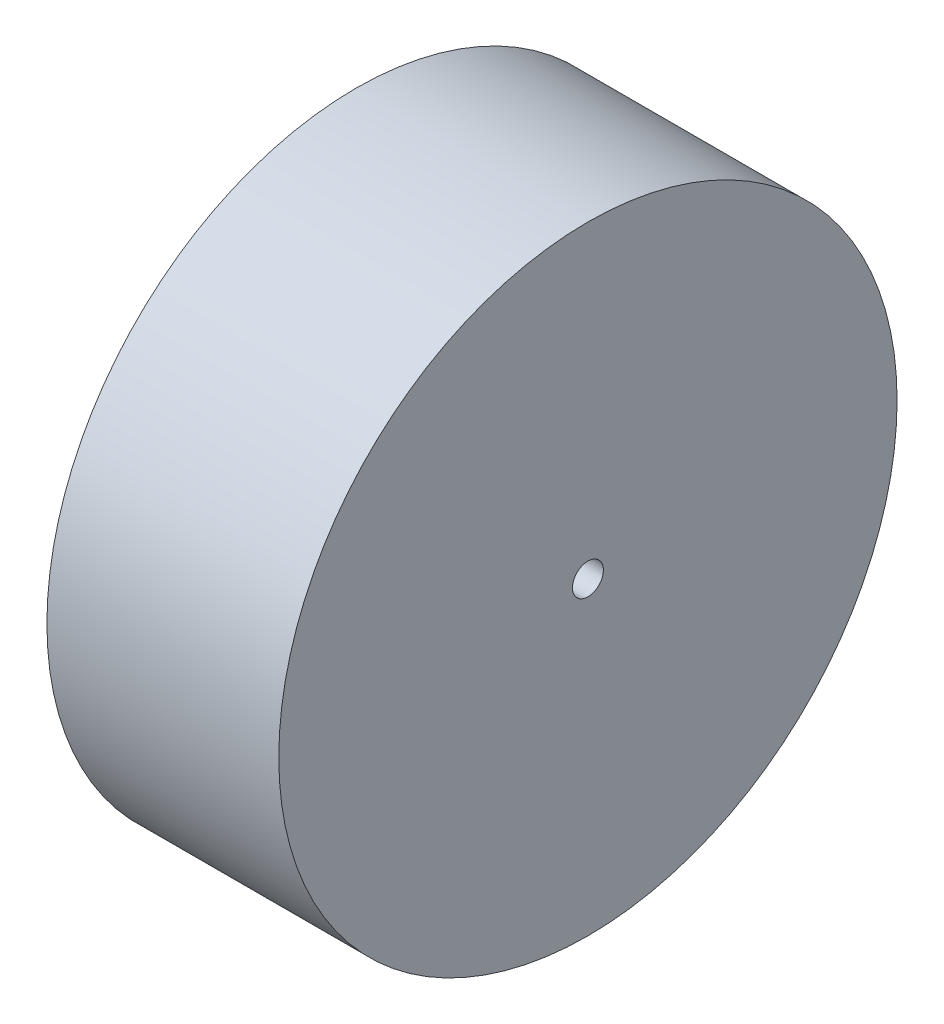
ISO-10303-21;
HEADER;
FILE_DESCRIPTION(('STEP AP214'),'2;1');
FILE_NAME('part.step','',(''),(''),'','','');
FILE_SCHEMA(('AUTOMOTIVE_DESIGN { 1 0 10303 214 1 1 1 1 }'));
ENDSEC;
DATA;
#1=APPLICATION_CONTEXT('core data for automotive mechanical design processes');
#2=APPLICATION_PROTOCOL_DEFINITION('international standard','automotive_design',2000,#1);
#3=PRODUCT_CONTEXT('',#1,'mechanical');
#4=PRODUCT('Part','Part','',(#3));
#5=PRODUCT_RELATED_PRODUCT_CATEGORY('part','',(#4));
#6=PRODUCT_DEFINITION_FORMATION('','',#4);
#7=PRODUCT_DEFINITION_CONTEXT('part definition',#1,'design');
#8=PRODUCT_DEFINITION('design','',#6,#7);
#9=PRODUCT_DEFINITION_SHAPE('','',#8);
#10=(LENGTH_UNIT() NAMED_UNIT(*) SI_UNIT(.MILLI.,.METRE.));
#11=(NAMED_UNIT(*) PLANE_ANGLE_UNIT() SI_UNIT($,.RADIAN.));
#12=(NAMED_UNIT(*) SI_UNIT($,.STERADIAN.) SOLID_ANGLE_UNIT());
#13=UNCERTAINTY_MEASURE_WITH_UNIT(LENGTH_MEASURE(1.E-05),#10,'distance_accuracy_value','');
#14=(GEOMETRIC_REPRESENTATION_CONTEXT(3) GLOBAL_UNCERTAINTY_ASSIGNED_CONTEXT((#13)) GLOBAL_UNIT_ASSIGNED_CONTEXT((#10,
#11,#12)) REPRESENTATION_CONTEXT('',''));
#15=CARTESIAN_POINT('',(0.,0.,0.));
#16=DIRECTION('',(0.,0.,1.));
#17=DIRECTION('',(1.,0.,0.));
#18=AXIS2_PLACEMENT_3D('',#15,#16,#17);
#19=CARTESIAN_POINT('',(9.525,0.,0.));
#20=DIRECTION('',(1.,0.,0.));
#21=DIRECTION('',(0.,0.,-1.));
#22=AXIS2_PLACEMENT_3D('',#19,#20,#21);
#23=PLANE('',#22);
#24=CARTESIAN_POINT('',(9.525,0.,0.));
#25=DIRECTION('',(1.,0.,0.));
#26=DIRECTION('',(0.,0.,-1.));
#27=AXIS2_PLACEMENT_3D('',#24,#25,#26);
#28=CIRCLE('',#27,25.4);
#29=CARTESIAN_POINT('',(9.525,0.,25.4));
#30=VERTEX_POINT('',#29);
#31=EDGE_CURVE('E10',#30,#30,#28,.T.);
#32=ORIENTED_EDGE('',*,*,#31,.T.);
#33=EDGE_LOOP('',(#32));
#34=FACE_BOUND('',#33,.T.);
#35=CARTESIAN_POINT('',(9.525,0.,0.));
#36=DIRECTION('',(1.,0.,0.));
#37=DIRECTION('',(0.,0.,-1.));
#38=AXIS2_PLACEMENT_3D('',#35,#36,#37);
#39=CIRCLE('',#38,1.27);
#40=CARTESIAN_POINT('',(9.525,0.,1.27));
#41=VERTEX_POINT('',#40);
#42=EDGE_CURVE('E49',#41,#41,#39,.T.);
#43=ORIENTED_EDGE('',*,*,#42,.F.);
#44=EDGE_LOOP('',(#43));
#45=FACE_BOUND('',#44,.T.);
#46=ADVANCED_FACE('F39',(#34,#45),#23,.T.);
#47=CARTESIAN_POINT('',(-9.525,0.,0.));
#48=DIRECTION('',(1.,0.,0.));
#49=DIRECTION('',(0.,0.,-1.));
#50=AXIS2_PLACEMENT_3D('',#47,#48,#49);
#51=PLANE('',#50);
#52=CARTESIAN_POINT('',(-9.525,0.,0.));
#53=DIRECTION('',(1.,0.,0.));
#54=DIRECTION('',(0.,0.,-1.));
#55=AXIS2_PLACEMENT_3D('',#52,#53,#54);
#56=CIRCLE('',#55,25.4);
#57=CARTESIAN_POINT('',(-9.525,0.,25.4));
#58=VERTEX_POINT('',#57);
#59=EDGE_CURVE('E43',#58,#58,#56,.T.);
#60=ORIENTED_EDGE('',*,*,#59,.F.);
#61=EDGE_LOOP('',(#60));
#62=FACE_BOUND('',#61,.T.);
#63=CARTESIAN_POINT('',(-9.525,0.,0.));
#64=DIRECTION('',(1.,0.,0.));
#65=DIRECTION('',(0.,0.,-1.));
#66=AXIS2_PLACEMENT_3D('',#63,#64,#65);
#67=CIRCLE('',#66,1.27);
#68=CARTESIAN_POINT('',(-9.525,0.,1.27));
#69=VERTEX_POINT('',#68);
#70=EDGE_CURVE('E55',#69,#69,#67,.T.);
#71=ORIENTED_EDGE('',*,*,#70,.T.);
#72=EDGE_LOOP('',(#71));
#73=FACE_BOUND('',#72,.T.);
#74=ADVANCED_FACE('F65',(#62,#73),#51,.F.);
#75=CARTESIAN_POINT('',(9.525,0.,0.));
#76=DIRECTION('',(-1.,0.,0.));
#77=DIRECTION('',(0.,0.,1.));
#78=AXIS2_PLACEMENT_3D('',#75,#76,#77);
#79=CYLINDRICAL_SURFACE('',#78,25.4);
#80=CARTESIAN_POINT('',(9.525,0.,25.4));
#81=CARTESIAN_POINT('',(9.3265625,0.,25.4));
#82=CARTESIAN_POINT('',(9.128125,0.,25.4));
#83=CARTESIAN_POINT('',(8.73125,0.,25.4));
#84=CARTESIAN_POINT('',(8.5328125,0.,25.4));
#85=CARTESIAN_POINT('',(8.1359375,0.,25.4));
#86=CARTESIAN_POINT('',(7.9375,0.,25.4));
#87=CARTESIAN_POINT('',(7.540625,0.,25.4));
#88=CARTESIAN_POINT('',(7.3421875,0.,25.4));
#89=CARTESIAN_POINT('',(6.9453125,0.,25.4));
#90=CARTESIAN_POINT('',(6.746875,0.,25.4));
#91=CARTESIAN_POINT('',(6.35,0.,25.4));
#92=CARTESIAN_POINT('',(6.1515625,0.,25.4));
#93=CARTESIAN_POINT('',(5.7546875,0.,25.4));
#94=CARTESIAN_POINT('',(5.55625,0.,25.4));
#95=CARTESIAN_POINT('',(5.159375,0.,25.4));
#96=CARTESIAN_POINT('',(4.9609375,0.,25.4));
#97=CARTESIAN_POINT('',(4.5640625,0.,25.4));
#98=CARTESIAN_POINT('',(4.365625,0.,25.4));
#99=CARTESIAN_POINT('',(3.96875,0.,25.4));
#100=CARTESIAN_POINT('',(3.7703125,0.,25.4));
#101=CARTESIAN_POINT('',(3.3734375,0.,25.4));
#102=CARTESIAN_POINT('',(3.175,0.,25.4));
#103=CARTESIAN_POINT('',(2.778125,0.,25.4));
#104=CARTESIAN_POINT('',(2.5796875,0.,25.4));
#105=CARTESIAN_POINT('',(2.1828125,0.,25.4));
#106=CARTESIAN_POINT('',(1.984375,0.,25.4));
#107=CARTESIAN_POINT('',(1.5875,0.,25.4));
#108=CARTESIAN_POINT('',(1.3890625,0.,25.4));
#109=CARTESIAN_POINT('',(0.992187499999999,0.,25.4));
#110=CARTESIAN_POINT('',(0.793749999999999,0.,25.4));
#111=CARTESIAN_POINT('',(0.396874999999998,0.,25.4));
#112=CARTESIAN_POINT('',(0.198437499999998,0.,25.4));
#113=CARTESIAN_POINT('',(-0.198437500000002,0.,25.4));
#114=CARTESIAN_POINT('',(-0.396875000000002,0.,25.4));
#115=CARTESIAN_POINT('',(-0.793750000000002,0.,25.4));
#116=CARTESIAN_POINT('',(-0.992187500000002,0.,25.4));
#117=CARTESIAN_POINT('',(-1.3890625,0.,25.4));
#118=CARTESIAN_POINT('',(-1.5875,0.,25.4));
#119=CARTESIAN_POINT('',(-1.984375,0.,25.4));
#120=CARTESIAN_POINT('',(-2.1828125,0.,25.4));
#121=CARTESIAN_POINT('',(-2.5796875,0.,25.4));
#122=CARTESIAN_POINT('',(-2.778125,0.,25.4));
#123=CARTESIAN_POINT('',(-3.175,0.,25.4));
#124=CARTESIAN_POINT('',(-3.3734375,0.,25.4));
#125=CARTESIAN_POINT('',(-3.7703125,0.,25.4));
#126=CARTESIAN_POINT('',(-3.96875,0.,25.4));
#127=CARTESIAN_POINT('',(-4.365625,0.,25.4));
#128=CARTESIAN_POINT('',(-4.5640625,0.,25.4));
#129=CARTESIAN_POINT('',(-4.9609375,0.,25.4));
#130=CARTESIAN_POINT('',(-5.159375,0.,25.4));
#131=CARTESIAN_POINT('',(-5.55625,0.,25.4));
#132=CARTESIAN_POINT('',(-5.7546875,0.,25.4));
#133=CARTESIAN_POINT('',(-6.1515625,0.,25.4));
#134=CARTESIAN_POINT('',(-6.35,0.,25.4));
#135=CARTESIAN_POINT('',(-6.746875,0.,25.4));
#136=CARTESIAN_POINT('',(-6.9453125,0.,25.4));
#137=CARTESIAN_POINT('',(-7.3421875,0.,25.4));
#138=CARTESIAN_POINT('',(-7.540625,0.,25.4));
#139=CARTESIAN_POINT('',(-7.9375,0.,25.4));
#140=CARTESIAN_POINT('',(-8.1359375,0.,25.4));
#141=CARTESIAN_POINT('',(-8.5328125,0.,25.4));
#142=CARTESIAN_POINT('',(-8.73125,0.,25.4));
#143=CARTESIAN_POINT('',(-9.128125,0.,25.4));
#144=CARTESIAN_POINT('',(-9.3265625,0.,25.4));
#145=CARTESIAN_POINT('',(-9.525,0.,25.4));
#146=B_SPLINE_CURVE_WITH_KNOTS('',3,(#80,#81,#82,#83,#84,#85,#86,#87,#88,#89,#90,#91,#92,#93,
#94,#95,#96,#97,#98,#99,#100,#101,#102,#103,#104,#105,#106,#107,#108,#109,#110,#111,#112,#113,
#114,#115,#116,#117,#118,#119,#120,#121,#122,#123,#124,#125,#126,#127,#128,#129,#130,#131,#132,
#133,#134,#135,#136,#137,#138,#139,#140,#141,#142,#143,#144,#145),.UNSPECIFIED.,.F.,.F.,(4,2,2,
2,2,2,2,2,2,2,2,2,2,2,2,2,2,2,2,2,2,2,2,2,2,2,2,2,2,2,2,2,4),(0.,0.595312499999999,1.190625,
1.7859375,2.38125,2.9765625,3.571875,4.1671875,4.7625,5.3578125,5.953125,6.5484375,7.14375,
7.7390625,8.334375,8.9296875,9.525,10.1203125,10.715625,11.3109375,11.90625,12.5015625,
13.096875,13.6921875,14.2875,14.8828125,15.478125,16.0734375,16.66875,17.2640625,17.859375,
18.4546875,19.05),.UNSPECIFIED.);
#147=EDGE_CURVE('BSEAM41',#30,#58,#146,.T.);
#148=ORIENTED_EDGE('',*,*,#31,.F.);
#149=ORIENTED_EDGE('',*,*,#59,.T.);
#150=ORIENTED_EDGE('',*,*,#147,.T.);
#151=ORIENTED_EDGE('',*,*,#147,.F.);
#152=EDGE_LOOP('',(#148,#150,#149,#151));
#153=FACE_BOUND('',#152,.T.);
#154=ADVANCED_FACE('F41',(#153),#79,.T.);
#155=CARTESIAN_POINT('',(9.525,0.,0.));
#156=DIRECTION('',(-1.,0.,0.));
#157=DIRECTION('',(0.,0.,1.));
#158=AXIS2_PLACEMENT_3D('',#155,#156,#157);
#159=CYLINDRICAL_SURFACE('',#158,1.27);
#160=CARTESIAN_POINT('',(9.525,0.,1.27));
#161=CARTESIAN_POINT('',(9.3265625,0.,1.27));
#162=CARTESIAN_POINT('',(9.128125,0.,1.27));
#163=CARTESIAN_POINT('',(8.73125,0.,1.27));
#164=CARTESIAN_POINT('',(8.5328125,0.,1.27));
#165=CARTESIAN_POINT('',(8.1359375,0.,1.27));
#166=CARTESIAN_POINT('',(7.9375,0.,1.27));
#167=CARTESIAN_POINT('',(7.540625,0.,1.27));
#168=CARTESIAN_POINT('',(7.3421875,0.,1.27));
#169=CARTESIAN_POINT('',(6.9453125,0.,1.27));
#170=CARTESIAN_POINT('',(6.746875,0.,1.27));
#171=CARTESIAN_POINT('',(6.35,0.,1.27));
#172=CARTESIAN_POINT('',(6.1515625,0.,1.27));
#173=CARTESIAN_POINT('',(5.7546875,0.,1.27));
#174=CARTESIAN_POINT('',(5.55625,0.,1.27));
#175=CARTESIAN_POINT('',(5.159375,0.,1.27));
#176=CARTESIAN_POINT('',(4.9609375,0.,1.27));
#177=CARTESIAN_POINT('',(4.5640625,0.,1.27));
#178=CARTESIAN_POINT('',(4.365625,0.,1.27));
#179=CARTESIAN_POINT('',(3.96875,0.,1.27));
#180=CARTESIAN_POINT('',(3.7703125,0.,1.27));
#181=CARTESIAN_POINT('',(3.3734375,0.,1.27));
#182=CARTESIAN_POINT('',(3.175,0.,1.27));
#183=CARTESIAN_POINT('',(2.778125,0.,1.27));
#184=CARTESIAN_POINT('',(2.5796875,0.,1.27));
#185=CARTESIAN_POINT('',(2.1828125,0.,1.27));
#186=CARTESIAN_POINT('',(1.984375,0.,1.27));
#187=CARTESIAN_POINT('',(1.5875,0.,1.27));
#188=CARTESIAN_POINT('',(1.3890625,0.,1.27));
#189=CARTESIAN_POINT('',(0.992187500000001,0.,1.27));
#190=CARTESIAN_POINT('',(0.793750000000001,0.,1.27));
#191=CARTESIAN_POINT('',(0.396875,0.,1.27));
#192=CARTESIAN_POINT('',(0.1984375,0.,1.27));
#193=CARTESIAN_POINT('',(-0.1984375,0.,1.27));
#194=CARTESIAN_POINT('',(-0.396875,0.,1.27));
#195=CARTESIAN_POINT('',(-0.793750000000001,0.,1.27));
#196=CARTESIAN_POINT('',(-0.992187500000001,0.,1.27));
#197=CARTESIAN_POINT('',(-1.3890625,0.,1.27));
#198=CARTESIAN_POINT('',(-1.5875,0.,1.27));
#199=CARTESIAN_POINT('',(-1.984375,0.,1.27));
#200=CARTESIAN_POINT('',(-2.1828125,0.,1.27));
#201=CARTESIAN_POINT('',(-2.5796875,0.,1.27));
#202=CARTESIAN_POINT('',(-2.778125,0.,1.27));
#203=CARTESIAN_POINT('',(-3.175,0.,1.27));
#204=CARTESIAN_POINT('',(-3.3734375,0.,1.27));
#205=CARTESIAN_POINT('',(-3.7703125,0.,1.27));
#206=CARTESIAN_POINT('',(-3.96875,0.,1.27));
#207=CARTESIAN_POINT('',(-4.365625,0.,1.27));
#208=CARTESIAN_POINT('',(-4.5640625,0.,1.27));
#209=CARTESIAN_POINT('',(-4.9609375,0.,1.27));
#210=CARTESIAN_POINT('',(-5.159375,0.,1.27));
#211=CARTESIAN_POINT('',(-5.55625,0.,1.27));
#212=CARTESIAN_POINT('',(-5.7546875,0.,1.27));
#213=CARTESIAN_POINT('',(-6.1515625,0.,1.27));
#214=CARTESIAN_POINT('',(-6.35,0.,1.27));
#215=CARTESIAN_POINT('',(-6.746875,0.,1.27));
#216=CARTESIAN_POINT('',(-6.9453125,0.,1.27));
#217=CARTESIAN_POINT('',(-7.3421875,0.,1.27));
#218=CARTESIAN_POINT('',(-7.540625,0.,1.27));
#219=CARTESIAN_POINT('',(-7.9375,0.,1.27));
#220=CARTESIAN_POINT('',(-8.1359375,0.,1.27));
#221=CARTESIAN_POINT('',(-8.5328125,0.,1.27));
#222=CARTESIAN_POINT('',(-8.73125,0.,1.27));
#223=CARTESIAN_POINT('',(-9.128125,0.,1.27));
#224=CARTESIAN_POINT('',(-9.3265625,0.,1.27));
#225=CARTESIAN_POINT('',(-9.525,0.,1.27));
#226=B_SPLINE_CURVE_WITH_KNOTS('',3,(#160,#161,#162,#163,#164,#165,#166,#167,#168,#169,#170,
#171,#172,#173,#174,#175,#176,#177,#178,#179,#180,#181,#182,#183,#184,#185,#186,#187,#188,#189,
#190,#191,#192,#193,#194,#195,#196,#197,#198,#199,#200,#201,#202,#203,#204,#205,#206,#207,#208,
#209,#210,#211,#212,#213,#214,#215,#216,#217,#218,#219,#220,#221,#222,#223,#224,#225),
.UNSPECIFIED.,.F.,.F.,(4,2,2,2,2,2,2,2,2,2,2,2,2,2,2,2,2,2,2,2,2,2,2,2,2,2,2,2,2,2,2,2,4),(0.,
0.5953125,1.190625,1.7859375,2.38125,2.9765625,3.571875,4.1671875,4.7625,5.3578125,5.953125,
6.5484375,7.14375,7.7390625,8.334375,8.9296875,9.525,10.1203125,10.715625,11.3109375,11.90625,
12.5015625,13.096875,13.6921875,14.2875,14.8828125,15.478125,16.0734375,16.66875,17.2640625,
17.859375,18.4546875,19.05),.UNSPECIFIED.);
#227=EDGE_CURVE('BSEAM59',#41,#69,#226,.T.);
#228=ORIENTED_EDGE('',*,*,#42,.T.);
#229=ORIENTED_EDGE('',*,*,#70,.F.);
#230=ORIENTED_EDGE('',*,*,#227,.T.);
#231=ORIENTED_EDGE('',*,*,#227,.F.);
#232=EDGE_LOOP('',(#228,#230,#229,#231));
#233=FACE_BOUND('',#232,.T.);
#234=ADVANCED_FACE('F59',(#233),#159,.F.);
#235=CLOSED_SHELL('',(#46,#74,#154,#234));
#236=MANIFOLD_SOLID_BREP('B2',#235);
#237=ADVANCED_BREP_SHAPE_REPRESENTATION('',(#18,#236),#14);
#238=SHAPE_DEFINITION_REPRESENTATION(#9,#237);
ENDSEC;
END-ISO-10303-21;
